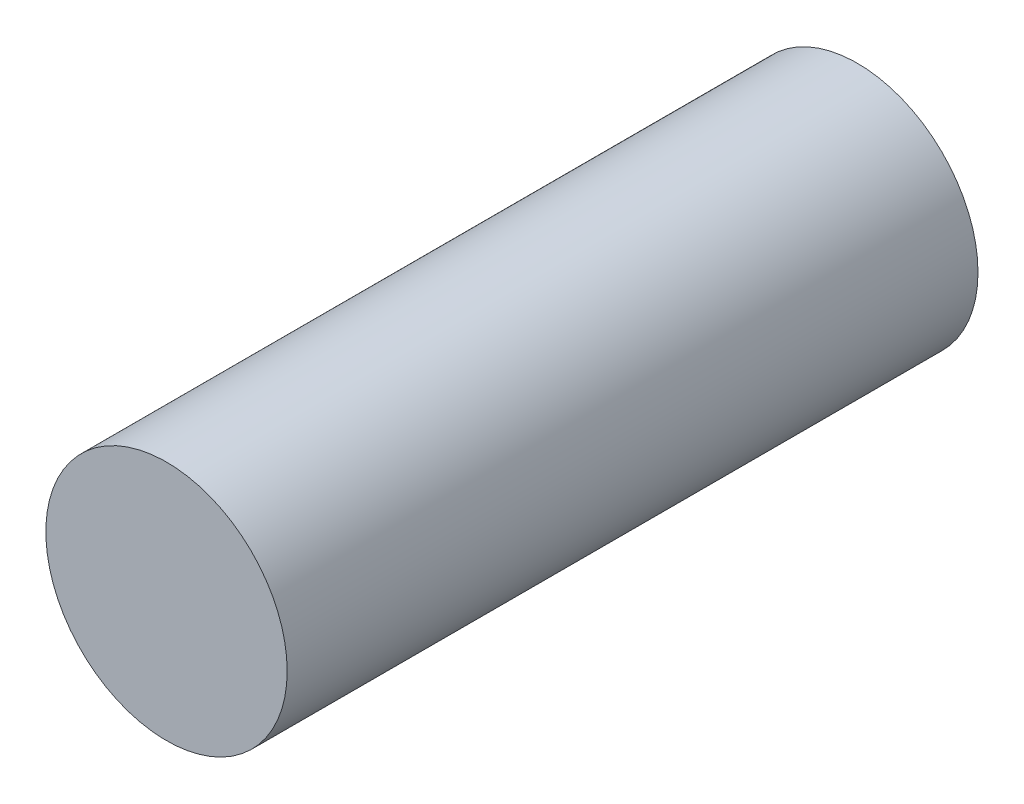
ISO-10303-21;
HEADER;
FILE_DESCRIPTION(('STEP AP214'),'2;1');
FILE_NAME('part.step','',(''),(''),'','','');
FILE_SCHEMA(('AUTOMOTIVE_DESIGN { 1 0 10303 214 1 1 1 1 }'));
ENDSEC;
DATA;
#1=APPLICATION_CONTEXT('core data for automotive mechanical design processes');
#2=APPLICATION_PROTOCOL_DEFINITION('international standard','automotive_design',2000,#1);
#3=PRODUCT_CONTEXT('',#1,'mechanical');
#4=PRODUCT('Part','Part','',(#3));
#5=PRODUCT_RELATED_PRODUCT_CATEGORY('part','',(#4));
#6=PRODUCT_DEFINITION_FORMATION('','',#4);
#7=PRODUCT_DEFINITION_CONTEXT('part definition',#1,'design');
#8=PRODUCT_DEFINITION('design','',#6,#7);
#9=PRODUCT_DEFINITION_SHAPE('','',#8);
#10=(LENGTH_UNIT() NAMED_UNIT(*) SI_UNIT(.MILLI.,.METRE.));
#11=(NAMED_UNIT(*) PLANE_ANGLE_UNIT() SI_UNIT($,.RADIAN.));
#12=(NAMED_UNIT(*) SI_UNIT($,.STERADIAN.) SOLID_ANGLE_UNIT());
#13=UNCERTAINTY_MEASURE_WITH_UNIT(LENGTH_MEASURE(1.E-05),#10,'distance_accuracy_value','');
#14=(GEOMETRIC_REPRESENTATION_CONTEXT(3) GLOBAL_UNCERTAINTY_ASSIGNED_CONTEXT((#13)) GLOBAL_UNIT_ASSIGNED_CONTEXT((#10,
#11,#12)) REPRESENTATION_CONTEXT('',''));
#15=CARTESIAN_POINT('',(0.,0.,0.));
#16=DIRECTION('',(0.,0.,1.));
#17=DIRECTION('',(1.,0.,0.));
#18=AXIS2_PLACEMENT_3D('',#15,#16,#17);
#19=CARTESIAN_POINT('',(0.,0.,17.175));
#20=DIRECTION('',(0.,0.,-1.));
#21=DIRECTION('',(-1.,0.,0.));
#22=AXIS2_PLACEMENT_3D('',#19,#20,#21);
#23=CYLINDRICAL_SURFACE('',#22,3.);
#24=CARTESIAN_POINT('',(0.,0.,17.175));
#25=DIRECTION('',(0.,0.,1.));
#26=DIRECTION('',(1.,0.,0.));
#27=AXIS2_PLACEMENT_3D('',#24,#25,#26);
#28=CIRCLE('',#27,3.);
#29=CARTESIAN_POINT('',(3.,0.,17.175));
#30=VERTEX_POINT('',#29);
#31=EDGE_CURVE('E10',#30,#30,#28,.T.);
#32=ORIENTED_EDGE('',*,*,#31,.F.);
#33=EDGE_LOOP('',(#32));
#34=FACE_BOUND('',#33,.T.);
#35=CARTESIAN_POINT('',(0.,0.,0.));
#36=DIRECTION('',(0.,0.,1.));
#37=DIRECTION('',(1.,0.,0.));
#38=AXIS2_PLACEMENT_3D('',#35,#36,#37);
#39=CIRCLE('',#38,3.);
#40=CARTESIAN_POINT('',(3.,0.,0.));
#41=VERTEX_POINT('',#40);
#42=EDGE_CURVE('E38',#41,#41,#39,.T.);
#43=ORIENTED_EDGE('',*,*,#42,.T.);
#44=EDGE_LOOP('',(#43));
#45=FACE_BOUND('',#44,.T.);
#46=ADVANCED_FACE('F35',(#34,#45),#23,.T.);
#47=CARTESIAN_POINT('',(0.,0.,17.175));
#48=DIRECTION('',(0.,0.,1.));
#49=DIRECTION('',(1.,0.,0.));
#50=AXIS2_PLACEMENT_3D('',#47,#48,#49);
#51=PLANE('',#50);
#52=ORIENTED_EDGE('',*,*,#31,.T.);
#53=EDGE_LOOP('',(#52));
#54=FACE_BOUND('',#53,.T.);
#55=ADVANCED_FACE('F51',(#54),#51,.T.);
#56=CARTESIAN_POINT('',(0.,0.,0.));
#57=DIRECTION('',(0.,0.,1.));
#58=DIRECTION('',(1.,0.,0.));
#59=AXIS2_PLACEMENT_3D('',#56,#57,#58);
#60=PLANE('',#59);
#61=ORIENTED_EDGE('',*,*,#42,.F.);
#62=EDGE_LOOP('',(#61));
#63=FACE_BOUND('',#62,.T.);
#64=ADVANCED_FACE('F49',(#63),#60,.F.);
#65=CLOSED_SHELL('',(#46,#55,#64));
#66=MANIFOLD_SOLID_BREP('B2',#65);
#67=ADVANCED_BREP_SHAPE_REPRESENTATION('',(#18,#66),#14);
#68=SHAPE_DEFINITION_REPRESENTATION(#9,#67);
ENDSEC;
END-ISO-10303-21;
